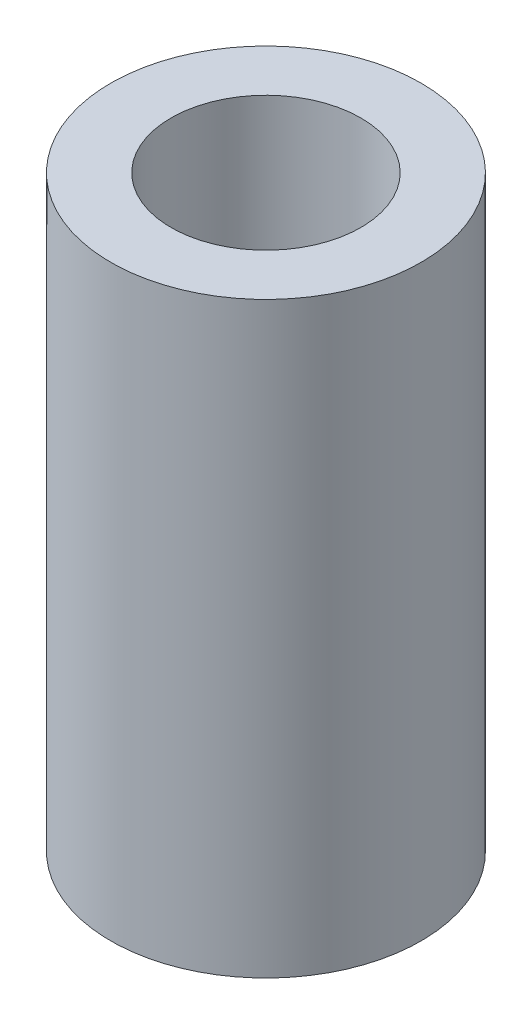
ISO-10303-21;
HEADER;
FILE_DESCRIPTION(('STEP AP214'),'2;1');
FILE_NAME('part.step','',(''),(''),'','','');
FILE_SCHEMA(('AUTOMOTIVE_DESIGN { 1 0 10303 214 1 1 1 1 }'));
ENDSEC;
DATA;
#1=APPLICATION_CONTEXT('core data for automotive mechanical design processes');
#2=APPLICATION_PROTOCOL_DEFINITION('international standard','automotive_design',2000,#1);
#3=PRODUCT_CONTEXT('',#1,'mechanical');
#4=PRODUCT('Part','Part','',(#3));
#5=PRODUCT_RELATED_PRODUCT_CATEGORY('part','',(#4));
#6=PRODUCT_DEFINITION_FORMATION('','',#4);
#7=PRODUCT_DEFINITION_CONTEXT('part definition',#1,'design');
#8=PRODUCT_DEFINITION('design','',#6,#7);
#9=PRODUCT_DEFINITION_SHAPE('','',#8);
#10=(LENGTH_UNIT() NAMED_UNIT(*) SI_UNIT(.MILLI.,.METRE.));
#11=(NAMED_UNIT(*) PLANE_ANGLE_UNIT() SI_UNIT($,.RADIAN.));
#12=(NAMED_UNIT(*) SI_UNIT($,.STERADIAN.) SOLID_ANGLE_UNIT());
#13=UNCERTAINTY_MEASURE_WITH_UNIT(LENGTH_MEASURE(1.E-05),#10,'distance_accuracy_value','');
#14=(GEOMETRIC_REPRESENTATION_CONTEXT(3) GLOBAL_UNCERTAINTY_ASSIGNED_CONTEXT((#13)) GLOBAL_UNIT_ASSIGNED_CONTEXT((#10,
#11,#12)) REPRESENTATION_CONTEXT('',''));
#15=CARTESIAN_POINT('',(0.,0.,0.));
#16=DIRECTION('',(0.,0.,1.));
#17=DIRECTION('',(1.,0.,0.));
#18=AXIS2_PLACEMENT_3D('',#15,#16,#17);
#19=CARTESIAN_POINT('',(-5.15,0.,0.));
#20=DIRECTION('',(0.,1.,0.));
#21=DIRECTION('',(0.,0.,1.));
#22=AXIS2_PLACEMENT_3D('',#19,#20,#21);
#23=PLANE('',#22);
#24=CARTESIAN_POINT('',(0.,0.,0.));
#25=DIRECTION('',(0.,-1.,0.));
#26=DIRECTION('',(0.,0.,-1.));
#27=AXIS2_PLACEMENT_3D('',#24,#25,#26);
#28=CIRCLE('',#27,4.35);
#29=CARTESIAN_POINT('',(0.,0.,-4.35));
#30=VERTEX_POINT('',#29);
#31=EDGE_CURVE('E10',#30,#30,#28,.T.);
#32=ORIENTED_EDGE('',*,*,#31,.F.);
#33=EDGE_LOOP('',(#32));
#34=FACE_BOUND('',#33,.T.);
#35=CARTESIAN_POINT('',(0.,0.,0.));
#36=DIRECTION('',(0.,-1.,0.));
#37=DIRECTION('',(0.,0.,-1.));
#38=AXIS2_PLACEMENT_3D('',#35,#36,#37);
#39=CIRCLE('',#38,5.15);
#40=CARTESIAN_POINT('',(0.,0.,-5.15));
#41=VERTEX_POINT('',#40);
#42=EDGE_CURVE('E55',#41,#41,#39,.T.);
#43=ORIENTED_EDGE('',*,*,#42,.T.);
#44=EDGE_LOOP('',(#43));
#45=FACE_BOUND('',#44,.T.);
#46=ADVANCED_FACE('F33',(#34,#45),#23,.F.);
#47=CARTESIAN_POINT('',(0.,0.,0.));
#48=DIRECTION('',(0.,-1.,0.));
#49=DIRECTION('',(0.,0.,-1.));
#50=AXIS2_PLACEMENT_3D('',#47,#48,#49);
#51=CYLINDRICAL_SURFACE('',#50,4.35);
#52=CARTESIAN_POINT('',(0.,9.25,0.));
#53=DIRECTION('',(0.,-1.,0.));
#54=DIRECTION('',(0.,0.,-1.));
#55=AXIS2_PLACEMENT_3D('',#52,#53,#54);
#56=CIRCLE('',#55,4.35);
#57=CARTESIAN_POINT('',(0.,9.25,-4.35));
#58=VERTEX_POINT('',#57);
#59=EDGE_CURVE('E39',#58,#58,#56,.T.);
#60=ORIENTED_EDGE('',*,*,#59,.F.);
#61=EDGE_LOOP('',(#60));
#62=FACE_BOUND('',#61,.T.);
#63=ORIENTED_EDGE('',*,*,#31,.T.);
#64=EDGE_LOOP('',(#63));
#65=FACE_BOUND('',#64,.T.);
#66=ADVANCED_FACE('F85',(#62,#65),#51,.F.);
#67=CARTESIAN_POINT('',(-4.35,9.25,0.));
#68=DIRECTION('',(0.,1.,0.));
#69=DIRECTION('',(0.,0.,1.));
#70=AXIS2_PLACEMENT_3D('',#67,#68,#69);
#71=PLANE('',#70);
#72=ORIENTED_EDGE('',*,*,#59,.T.);
#73=EDGE_LOOP('',(#72));
#74=FACE_BOUND('',#73,.T.);
#75=ADVANCED_FACE('F80',(#74),#71,.F.);
#76=CARTESIAN_POINT('',(0.,10.25,0.));
#77=DIRECTION('',(0.,-1.,0.));
#78=DIRECTION('',(0.,0.,-1.));
#79=AXIS2_PLACEMENT_3D('',#76,#77,#78);
#80=PLANE('',#79);
#81=CARTESIAN_POINT('',(0.,10.25,0.));
#82=DIRECTION('',(0.,-1.,0.));
#83=DIRECTION('',(0.,0.,-1.));
#84=AXIS2_PLACEMENT_3D('',#81,#82,#83);
#85=CIRCLE('',#84,3.15);
#86=CARTESIAN_POINT('',(0.,10.25,-3.15));
#87=VERTEX_POINT('',#86);
#88=EDGE_CURVE('E43',#87,#87,#85,.T.);
#89=ORIENTED_EDGE('',*,*,#88,.F.);
#90=EDGE_LOOP('',(#89));
#91=FACE_BOUND('',#90,.T.);
#92=ADVANCED_FACE('F75',(#91),#80,.F.);
#93=CARTESIAN_POINT('',(0.,0.,0.));
#94=DIRECTION('',(0.,-1.,0.));
#95=DIRECTION('',(0.,0.,-1.));
#96=AXIS2_PLACEMENT_3D('',#93,#94,#95);
#97=CYLINDRICAL_SURFACE('',#96,3.15);
#98=CARTESIAN_POINT('',(0.,19.5,0.));
#99=DIRECTION('',(0.,-1.,0.));
#100=DIRECTION('',(0.,0.,-1.));
#101=AXIS2_PLACEMENT_3D('',#98,#99,#100);
#102=CIRCLE('',#101,3.15);
#103=CARTESIAN_POINT('',(0.,19.5,-3.15));
#104=VERTEX_POINT('',#103);
#105=EDGE_CURVE('E47',#104,#104,#102,.T.);
#106=ORIENTED_EDGE('',*,*,#105,.F.);
#107=EDGE_LOOP('',(#106));
#108=FACE_BOUND('',#107,.T.);
#109=ORIENTED_EDGE('',*,*,#88,.T.);
#110=EDGE_LOOP('',(#109));
#111=FACE_BOUND('',#110,.T.);
#112=ADVANCED_FACE('F69',(#108,#111),#97,.F.);
#113=CARTESIAN_POINT('',(-3.15,19.5,0.));
#114=DIRECTION('',(0.,-1.,0.));
#115=DIRECTION('',(0.,0.,-1.));
#116=AXIS2_PLACEMENT_3D('',#113,#114,#115);
#117=PLANE('',#116);
#118=CARTESIAN_POINT('',(0.,19.5,0.));
#119=DIRECTION('',(0.,-1.,0.));
#120=DIRECTION('',(0.,0.,-1.));
#121=AXIS2_PLACEMENT_3D('',#118,#119,#120);
#122=CIRCLE('',#121,5.15);
#123=CARTESIAN_POINT('',(0.,19.5,-5.15));
#124=VERTEX_POINT('',#123);
#125=EDGE_CURVE('E52',#124,#124,#122,.T.);
#126=ORIENTED_EDGE('',*,*,#125,.F.);
#127=EDGE_LOOP('',(#126));
#128=FACE_BOUND('',#127,.T.);
#129=ORIENTED_EDGE('',*,*,#105,.T.);
#130=EDGE_LOOP('',(#129));
#131=FACE_BOUND('',#130,.T.);
#132=ADVANCED_FACE('F63',(#128,#131),#117,.F.);
#133=CARTESIAN_POINT('',(0.,0.,0.));
#134=DIRECTION('',(0.,-1.,0.));
#135=DIRECTION('',(0.,0.,-1.));
#136=AXIS2_PLACEMENT_3D('',#133,#134,#135);
#137=CYLINDRICAL_SURFACE('',#136,5.15);
#138=ORIENTED_EDGE('',*,*,#42,.F.);
#139=EDGE_LOOP('',(#138));
#140=FACE_BOUND('',#139,.T.);
#141=ORIENTED_EDGE('',*,*,#125,.T.);
#142=EDGE_LOOP('',(#141));
#143=FACE_BOUND('',#142,.T.);
#144=ADVANCED_FACE('F60',(#140,#143),#137,.T.);
#145=CLOSED_SHELL('',(#46,#66,#75,#92,#112,#132,#144));
#146=MANIFOLD_SOLID_BREP('B2',#145);
#147=ADVANCED_BREP_SHAPE_REPRESENTATION('',(#18,#146),#14);
#148=SHAPE_DEFINITION_REPRESENTATION(#9,#147);
ENDSEC;
END-ISO-10303-21;
